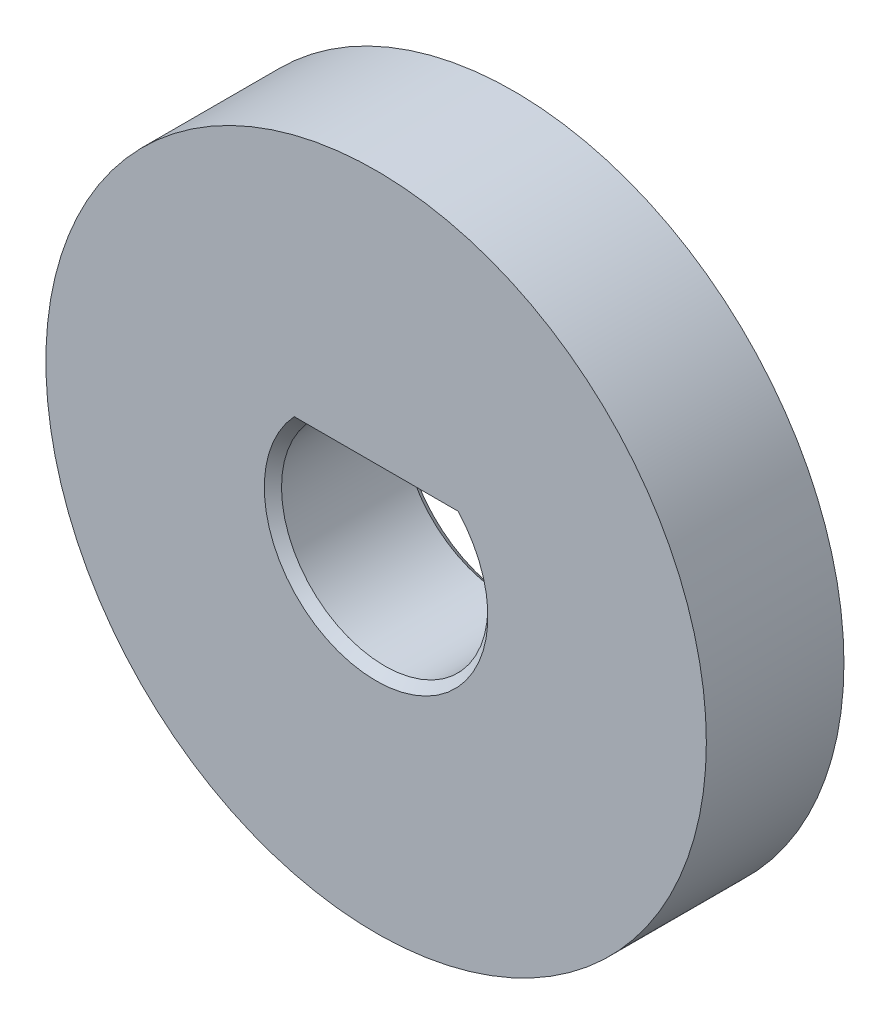
ISO-10303-21;
HEADER;
FILE_DESCRIPTION(('STEP AP214'),'2;1');
FILE_NAME('part.step','',(''),(''),'','','');
FILE_SCHEMA(('AUTOMOTIVE_DESIGN { 1 0 10303 214 1 1 1 1 }'));
ENDSEC;
DATA;
#1=APPLICATION_CONTEXT('core data for automotive mechanical design processes');
#2=APPLICATION_PROTOCOL_DEFINITION('international standard','automotive_design',2000,#1);
#3=PRODUCT_CONTEXT('',#1,'mechanical');
#4=PRODUCT('Part','Part','',(#3));
#5=PRODUCT_RELATED_PRODUCT_CATEGORY('part','',(#4));
#6=PRODUCT_DEFINITION_FORMATION('','',#4);
#7=PRODUCT_DEFINITION_CONTEXT('part definition',#1,'design');
#8=PRODUCT_DEFINITION('design','',#6,#7);
#9=PRODUCT_DEFINITION_SHAPE('','',#8);
#10=(LENGTH_UNIT() NAMED_UNIT(*) SI_UNIT(.MILLI.,.METRE.));
#11=(NAMED_UNIT(*) PLANE_ANGLE_UNIT() SI_UNIT($,.RADIAN.));
#12=(NAMED_UNIT(*) SI_UNIT($,.STERADIAN.) SOLID_ANGLE_UNIT());
#13=UNCERTAINTY_MEASURE_WITH_UNIT(LENGTH_MEASURE(1.E-05),#10,'distance_accuracy_value','');
#14=(GEOMETRIC_REPRESENTATION_CONTEXT(3) GLOBAL_UNCERTAINTY_ASSIGNED_CONTEXT((#13)) GLOBAL_UNIT_ASSIGNED_CONTEXT((#10,
#11,#12)) REPRESENTATION_CONTEXT('',''));
#15=CARTESIAN_POINT('',(0.,0.,0.));
#16=DIRECTION('',(0.,0.,1.));
#17=DIRECTION('',(1.,0.,0.));
#18=AXIS2_PLACEMENT_3D('',#15,#16,#17);
#19=CARTESIAN_POINT('',(0.,0.,6.35));
#20=DIRECTION('',(0.,0.,1.));
#21=DIRECTION('',(1.,0.,0.));
#22=AXIS2_PLACEMENT_3D('',#19,#20,#21);
#23=PLANE('',#22);
#24=CARTESIAN_POINT('',(0.,0.,6.35));
#25=DIRECTION('',(0.,0.,1.));
#26=DIRECTION('',(1.,0.,0.));
#27=AXIS2_PLACEMENT_3D('',#24,#25,#26);
#28=CIRCLE('',#27,10.31875);
#29=CARTESIAN_POINT('',(7.55817283227238,7.025,6.35));
#30=VERTEX_POINT('',#29);
#31=CARTESIAN_POINT('',(-7.55817283227237,7.025,6.35));
#32=VERTEX_POINT('',#31);
#33=EDGE_CURVE('E95',#30,#32,#28,.F.);
#34=ORIENTED_EDGE('',*,*,#33,.T.);
#35=DIRECTION('',(-1.,0.,0.));
#36=VECTOR('',#35,1.);
#37=CARTESIAN_POINT('',(0.,7.025,6.35));
#38=LINE('',#37,#36);
#39=EDGE_CURVE('E62',#30,#32,#38,.T.);
#40=ORIENTED_EDGE('',*,*,#39,.F.);
#41=EDGE_LOOP('',(#34,#40));
#42=FACE_BOUND('',#41,.T.);
#43=CARTESIAN_POINT('',(0.,0.,6.35));
#44=DIRECTION('',(0.,0.,1.));
#45=DIRECTION('',(1.,0.,0.));
#46=AXIS2_PLACEMENT_3D('',#43,#44,#45);
#47=CIRCLE('',#46,30.48);
#48=CARTESIAN_POINT('',(30.48,0.,6.35));
#49=VERTEX_POINT('',#48);
#50=EDGE_CURVE('E112',#49,#49,#47,.T.);
#51=ORIENTED_EDGE('',*,*,#50,.T.);
#52=EDGE_LOOP('',(#51));
#53=FACE_BOUND('',#52,.T.);
#54=ADVANCED_FACE('F41',(#42,#53),#23,.T.);
#55=CARTESIAN_POINT('',(0.,0.,-6.35));
#56=DIRECTION('',(0.,0.,1.));
#57=DIRECTION('',(1.,0.,0.));
#58=AXIS2_PLACEMENT_3D('',#55,#56,#57);
#59=PLANE('',#58);
#60=CARTESIAN_POINT('',(0.,0.,-6.35));
#61=DIRECTION('',(0.,0.,1.));
#62=DIRECTION('',(1.,0.,0.));
#63=AXIS2_PLACEMENT_3D('',#60,#61,#62);
#64=CIRCLE('',#63,10.31875);
#65=CARTESIAN_POINT('',(-7.55817283227237,7.025,-6.35));
#66=VERTEX_POINT('',#65);
#67=CARTESIAN_POINT('',(7.55817283227237,7.025,-6.35));
#68=VERTEX_POINT('',#67);
#69=EDGE_CURVE('E108',#66,#68,#64,.T.);
#70=ORIENTED_EDGE('',*,*,#69,.T.);
#71=DIRECTION('',(-1.,0.,0.));
#72=VECTOR('',#71,1.);
#73=CARTESIAN_POINT('',(0.,7.025,-6.35));
#74=LINE('',#73,#72);
#75=EDGE_CURVE('E91',#68,#66,#74,.T.);
#76=ORIENTED_EDGE('',*,*,#75,.T.);
#77=EDGE_LOOP('',(#70,#76));
#78=FACE_BOUND('',#77,.T.);
#79=CARTESIAN_POINT('',(0.,0.,-6.35));
#80=DIRECTION('',(0.,0.,1.));
#81=DIRECTION('',(1.,0.,0.));
#82=AXIS2_PLACEMENT_3D('',#79,#80,#81);
#83=CIRCLE('',#82,30.48);
#84=CARTESIAN_POINT('',(30.48,0.,-6.35));
#85=VERTEX_POINT('',#84);
#86=EDGE_CURVE('E113',#85,#85,#83,.T.);
#87=ORIENTED_EDGE('',*,*,#86,.F.);
#88=EDGE_LOOP('',(#87));
#89=FACE_BOUND('',#88,.T.);
#90=ADVANCED_FACE('F145',(#78,#89),#59,.F.);
#91=CARTESIAN_POINT('',(0.,0.,6.35));
#92=DIRECTION('',(0.,0.,-1.));
#93=DIRECTION('',(-1.,0.,0.));
#94=AXIS2_PLACEMENT_3D('',#91,#92,#93);
#95=CYLINDRICAL_SURFACE('',#94,30.48);
#96=ORIENTED_EDGE('',*,*,#50,.F.);
#97=EDGE_LOOP('',(#96));
#98=FACE_BOUND('',#97,.T.);
#99=ORIENTED_EDGE('',*,*,#86,.T.);
#100=EDGE_LOOP('',(#99));
#101=FACE_BOUND('',#100,.T.);
#102=ADVANCED_FACE('F141',(#98,#101),#95,.T.);
#103=CARTESIAN_POINT('',(0.,0.,6.35));
#104=DIRECTION('',(0.,0.,-1.));
#105=DIRECTION('',(-1.,0.,0.));
#106=AXIS2_PLACEMENT_3D('',#103,#104,#105);
#107=CYLINDRICAL_SURFACE('',#106,9.525);
#108=DIRECTION('',(0.,0.,-1.));
#109=VECTOR('',#108,1.);
#110=CARTESIAN_POINT('',(-6.4323401651343,7.025,6.35));
#111=LINE('',#110,#109);
#112=CARTESIAN_POINT('',(-6.4323401651343,7.025,5.55624999999999));
#113=VERTEX_POINT('',#112);
#114=CARTESIAN_POINT('',(-6.4323401651343,7.025,-5.55624999999998));
#115=VERTEX_POINT('',#114);
#116=EDGE_CURVE('E69',#113,#115,#111,.T.);
#117=ORIENTED_EDGE('',*,*,#116,.F.);
#118=CARTESIAN_POINT('',(0.,0.,5.55624999999999));
#119=DIRECTION('',(0.,0.,1.));
#120=DIRECTION('',(1.,0.,0.));
#121=AXIS2_PLACEMENT_3D('',#118,#119,#120);
#122=CIRCLE('',#121,9.525);
#123=CARTESIAN_POINT('',(6.4323401651343,7.025,5.55624999999999));
#124=VERTEX_POINT('',#123);
#125=EDGE_CURVE('E97',#113,#124,#122,.T.);
#126=ORIENTED_EDGE('',*,*,#125,.T.);
#127=DIRECTION('',(0.,0.,-1.));
#128=VECTOR('',#127,1.);
#129=CARTESIAN_POINT('',(6.4323401651343,7.025,6.35));
#130=LINE('',#129,#128);
#131=CARTESIAN_POINT('',(6.4323401651343,7.025,-5.55624999999998));
#132=VERTEX_POINT('',#131);
#133=EDGE_CURVE('E90',#132,#124,#130,.F.);
#134=ORIENTED_EDGE('',*,*,#133,.F.);
#135=CARTESIAN_POINT('',(0.,0.,-5.55624999999998));
#136=DIRECTION('',(0.,0.,1.));
#137=DIRECTION('',(1.,0.,0.));
#138=AXIS2_PLACEMENT_3D('',#135,#136,#137);
#139=CIRCLE('',#138,9.525);
#140=EDGE_CURVE('E100',#132,#115,#139,.F.);
#141=ORIENTED_EDGE('',*,*,#140,.T.);
#142=EDGE_LOOP('',(#117,#126,#134,#141));
#143=FACE_BOUND('',#142,.T.);
#144=ADVANCED_FACE('F137',(#143),#107,.F.);
#145=CARTESIAN_POINT('',(0.,0.,-6.35));
#146=DIRECTION('',(0.,0.,-1.));
#147=DIRECTION('',(-1.,0.,0.));
#148=AXIS2_PLACEMENT_3D('',#145,#146,#147);
#149=CONICAL_SURFACE('',#148,10.31875,0.785398163397442);
#150=CARTESIAN_POINT('',(7.55887283227237,7.025,-6.3505127398698));
#151=CARTESIAN_POINT('',(7.35918376734584,7.025,-6.20428210737378));
#152=CARTESIAN_POINT('',(7.15823650909129,7.025,-6.05973510950676));
#153=CARTESIAN_POINT('',(6.75330813641482,7.025,-5.77480510392177));
#154=CARTESIAN_POINT('',(6.54932596627356,7.025,-5.63442359857721));
#155=CARTESIAN_POINT('',(6.13572671734289,7.025,-5.35723538660261));
#156=CARTESIAN_POINT('',(5.92607255101003,7.025,-5.22048378604721));
#157=CARTESIAN_POINT('',(5.50275471913161,7.025,-4.953355003917));
#158=CARTESIAN_POINT('',(5.28909143621303,7.025,-4.82297721826931));
#159=CARTESIAN_POINT('',(4.84720322304359,7.025,-4.56427107586427));
#160=CARTESIAN_POINT('',(4.61876043588918,7.025,-4.43631250634792));
#161=CARTESIAN_POINT('',(4.15604697189046,7.025,-4.19120319052273));
#162=CARTESIAN_POINT('',(3.92177517493467,7.025,-4.07405454215036));
#163=CARTESIAN_POINT('',(3.44783902345875,7.025,-3.85393355395983));
#164=CARTESIAN_POINT('',(3.2082025462592,7.025,-3.75090178751881));
#165=CARTESIAN_POINT('',(2.7222966344759,7.025,-3.56195297840614));
#166=CARTESIAN_POINT('',(2.47603006971897,7.025,-3.47602866181998));
#167=CARTESIAN_POINT('',(1.99237061337792,7.025,-3.32990663640796));
#168=CARTESIAN_POINT('',(1.75536251931876,7.025,-3.26845237530357));
#169=CARTESIAN_POINT('',(1.27660854390952,7.025,-3.16747270361179));
#170=CARTESIAN_POINT('',(1.03486225677417,7.025,-3.12794917977334));
#171=CARTESIAN_POINT('',(0.55269320041436,7.025,-3.07395724161466));
#172=CARTESIAN_POINT('',(0.312317663752035,7.025,-3.05907476799947));
#173=CARTESIAN_POINT('',(-0.168684811790302,7.025,-3.05415939058828));
#174=CARTESIAN_POINT('',(-0.409311740248241,7.025,-3.06412549454261));
#175=CARTESIAN_POINT('',(-0.887554271636103,7.025,-3.10810027201536));
#176=CARTESIAN_POINT('',(-1.12517692268702,7.025,-3.14203391318885));
#177=CARTESIAN_POINT('',(-1.59626144111939,7.025,-3.23160603938917));
#178=CARTESIAN_POINT('',(-1.82972256784796,7.025,-3.2872483484994));
#179=CARTESIAN_POINT('',(-2.29513103306947,7.025,-3.41823297936479));
#180=CARTESIAN_POINT('',(-2.52698980625695,7.025,-3.49388525698236));
#181=CARTESIAN_POINT('',(-2.98482535058204,7.025,-3.6610832726471));
#182=CARTESIAN_POINT('',(-3.21080225130833,7.025,-3.75262866019782));
#183=CARTESIAN_POINT('',(-3.62223490032214,7.025,-3.93331260256053));
#184=CARTESIAN_POINT('',(-3.80851369015214,7.025,-4.02059974805053));
#185=CARTESIAN_POINT('',(-4.17730547652864,7.025,-4.20283487097954));
#186=CARTESIAN_POINT('',(-4.35981788631633,7.025,-4.29778403092632));
#187=CARTESIAN_POINT('',(-4.72157623630672,7.025,-4.49415765684352));
#188=CARTESIAN_POINT('',(-4.9008182296593,7.025,-4.59558935726586));
#189=CARTESIAN_POINT('',(-5.25618202441421,7.025,-4.80378331806421));
#190=CARTESIAN_POINT('',(-5.43230364666881,7.025,-4.91054588316254));
#191=CARTESIAN_POINT('',(-5.77438365628094,7.025,-5.12394084059766));
#192=CARTESIAN_POINT('',(-5.94045743064147,7.025,-5.23038886935131));
#193=CARTESIAN_POINT('',(-6.27032150157057,7.025,-5.44677261375206));
#194=CARTESIAN_POINT('',(-6.43411171217845,7.025,-5.55670846018435));
#195=CARTESIAN_POINT('',(-6.75910887197629,7.025,-5.77918172824511));
#196=CARTESIAN_POINT('',(-6.92032261604102,7.025,-5.89170924773562));
#197=CARTESIAN_POINT('',(-7.24091463316011,7.025,-6.11930298739434));
#198=CARTESIAN_POINT('',(-7.40029316678262,7.025,-6.23436884022645));
#199=CARTESIAN_POINT('',(-7.55887283227237,7.025,-6.3505127398698));
#200=B_SPLINE_CURVE_WITH_KNOTS('',3,(#150,#151,#152,#153,#154,#155,#156,#157,#158,#159,#160,
#161,#162,#163,#164,#165,#166,#167,#168,#169,#170,#171,#172,#173,#174,#175,#176,#177,#178,#179,
#180,#181,#182,#183,#184,#185,#186,#187,#188,#189,#190,#191,#192,#193,#194,#195,#196,#197,#198,
#199),.UNSPECIFIED.,.F.,.F.,(4,2,2,2,2,2,2,2,2,2,2,2,2,2,2,2,2,2,2,2,2,2,2,2,4),(0.,
0.742538822186623,1.48534227943686,2.2361819661253,2.98695035411688,3.77223452403001,
4.55767077890547,5.33969179334179,6.12137958691087,6.85502693102897,7.58873738263889,
8.30998884371148,9.03121150434058,9.75018626868392,10.46928774102,11.2002565723871,
11.9312092854837,12.5481605799352,13.1652072735981,13.7829550344109,14.4007381473705,
14.992469614563,15.5842232966196,16.1740029205942,16.7636977470925),.UNSPECIFIED.);
#201=EDGE_CURVE('E123',#68,#132,#200,.T.);
#202=ORIENTED_EDGE('',*,*,#201,.F.);
#203=ORIENTED_EDGE('',*,*,#69,.F.);
#204=EDGE_CURVE('E117',#115,#66,#200,.T.);
#205=ORIENTED_EDGE('',*,*,#204,.F.);
#206=ORIENTED_EDGE('',*,*,#140,.F.);
#207=EDGE_LOOP('',(#202,#203,#205,#206));
#208=FACE_BOUND('',#207,.T.);
#209=ADVANCED_FACE('F131',(#208),#149,.F.);
#210=CARTESIAN_POINT('',(0.,0.,5.55624999999999));
#211=DIRECTION('',(0.,0.,1.));
#212=DIRECTION('',(1.,0.,0.));
#213=AXIS2_PLACEMENT_3D('',#210,#211,#212);
#214=CONICAL_SURFACE('',#213,9.525,0.78539816339745);
#215=CARTESIAN_POINT('',(-7.55887283227237,7.025,6.35051273986979));
#216=CARTESIAN_POINT('',(-7.35918376734584,7.025,6.20428210737377));
#217=CARTESIAN_POINT('',(-7.15823650909128,7.025,6.05973510950675));
#218=CARTESIAN_POINT('',(-6.75330813641482,7.025,5.77480510392177));
#219=CARTESIAN_POINT('',(-6.54932596627355,7.025,5.63442359857722));
#220=CARTESIAN_POINT('',(-6.13572671734288,7.025,5.35723538660262));
#221=CARTESIAN_POINT('',(-5.92607255101002,7.025,5.22048378604722));
#222=CARTESIAN_POINT('',(-5.5027547191316,7.025,4.95335500391701));
#223=CARTESIAN_POINT('',(-5.28909143621302,7.025,4.82297721826932));
#224=CARTESIAN_POINT('',(-4.84720322304358,7.025,4.56427107586429));
#225=CARTESIAN_POINT('',(-4.61876043588917,7.025,4.43631250634794));
#226=CARTESIAN_POINT('',(-4.15604697189045,7.025,4.19120319052276));
#227=CARTESIAN_POINT('',(-3.92177517493466,7.025,4.07405454215038));
#228=CARTESIAN_POINT('',(-3.44783902345874,7.025,3.85393355395986));
#229=CARTESIAN_POINT('',(-3.20820254625919,7.025,3.75090178751885));
#230=CARTESIAN_POINT('',(-2.7222966344759,7.025,3.56195297840618));
#231=CARTESIAN_POINT('',(-2.47603006971896,7.025,3.47602866182002));
#232=CARTESIAN_POINT('',(-1.99237061337791,7.025,3.329906636408));
#233=CARTESIAN_POINT('',(-1.75536251931875,7.025,3.26845237530362));
#234=CARTESIAN_POINT('',(-1.2766085439095,7.025,3.16747270361183));
#235=CARTESIAN_POINT('',(-1.03486225677414,7.025,3.12794917977338));
#236=CARTESIAN_POINT('',(-0.552693200414325,7.025,3.07395724161471));
#237=CARTESIAN_POINT('',(-0.312317663751996,7.025,3.05907476799952));
#238=CARTESIAN_POINT('',(0.16868481179035,7.025,3.05415939058833));
#239=CARTESIAN_POINT('',(0.409311740248292,7.025,3.06412549454267));
#240=CARTESIAN_POINT('',(0.887554271636161,7.025,3.10810027201542));
#241=CARTESIAN_POINT('',(1.12517692268709,7.025,3.14203391318891));
#242=CARTESIAN_POINT('',(1.59626144111946,7.025,3.23160603938924));
#243=CARTESIAN_POINT('',(1.82972256784803,7.025,3.28724834849946));
#244=CARTESIAN_POINT('',(2.29513103306955,7.025,3.41823297936486));
#245=CARTESIAN_POINT('',(2.52698980625703,7.025,3.49388525698243));
#246=CARTESIAN_POINT('',(2.98482535058213,7.025,3.66108327264718));
#247=CARTESIAN_POINT('',(3.21080225130843,7.025,3.75262866019789));
#248=CARTESIAN_POINT('',(3.62223490032223,7.025,3.93331260256061));
#249=CARTESIAN_POINT('',(3.80851369015222,7.025,4.02059974805061));
#250=CARTESIAN_POINT('',(4.17730547652872,7.025,4.20283487097961));
#251=CARTESIAN_POINT('',(4.3598178863164,7.025,4.29778403092639));
#252=CARTESIAN_POINT('',(4.72157623630678,7.025,4.49415765684357));
#253=CARTESIAN_POINT('',(4.90081822965935,7.025,4.59558935726591));
#254=CARTESIAN_POINT('',(5.25618202441425,7.025,4.80378331806426));
#255=CARTESIAN_POINT('',(5.43230364666885,7.025,4.91054588316259));
#256=CARTESIAN_POINT('',(5.77438365628097,7.025,5.1239408405977));
#257=CARTESIAN_POINT('',(5.94045743064149,7.025,5.23038886935134));
#258=CARTESIAN_POINT('',(6.27032150157059,7.025,5.44677261375208));
#259=CARTESIAN_POINT('',(6.43411171217847,7.025,5.55670846018437));
#260=CARTESIAN_POINT('',(6.7591088719763,7.025,5.77918172824513));
#261=CARTESIAN_POINT('',(6.92032261604103,7.025,5.89170924773563));
#262=CARTESIAN_POINT('',(7.24091463316012,7.025,6.11930298739434));
#263=CARTESIAN_POINT('',(7.40029316678262,7.025,6.23436884022645));
#264=CARTESIAN_POINT('',(7.55887283227237,7.025,6.35051273986979));
#265=B_SPLINE_CURVE_WITH_KNOTS('',3,(#215,#216,#217,#218,#219,#220,#221,#222,#223,#224,#225,
#226,#227,#228,#229,#230,#231,#232,#233,#234,#235,#236,#237,#238,#239,#240,#241,#242,#243,#244,
#245,#246,#247,#248,#249,#250,#251,#252,#253,#254,#255,#256,#257,#258,#259,#260,#261,#262,#263,
#264),.UNSPECIFIED.,.F.,.F.,(4,2,2,2,2,2,2,2,2,2,2,2,2,2,2,2,2,2,2,2,2,2,2,2,4),(0.,
0.742538822186624,1.48534227943686,2.23618196612529,2.98695035411688,3.77223452403001,
4.55767077890546,5.33969179334177,6.12137958691085,6.85502693102896,7.5887373826389,
8.30998884371149,9.03121150434061,9.75018626868396,10.4692877410201,11.2002565723872,
11.9312092854837,12.5481605799352,13.1652072735981,13.7829550344109,14.4007381473705,
14.992469614563,15.5842232966196,16.1740029205941,16.7636977470924),.UNSPECIFIED.);
#266=EDGE_CURVE('E11',#32,#113,#265,.T.);
#267=ORIENTED_EDGE('',*,*,#266,.F.);
#268=ORIENTED_EDGE('',*,*,#33,.F.);
#269=EDGE_CURVE('E46',#124,#30,#265,.T.);
#270=ORIENTED_EDGE('',*,*,#269,.F.);
#271=ORIENTED_EDGE('',*,*,#125,.F.);
#272=EDGE_LOOP('',(#267,#268,#270,#271));
#273=FACE_BOUND('',#272,.T.);
#274=ADVANCED_FACE('F43',(#273),#214,.F.);
#275=CARTESIAN_POINT('',(0.,7.025,6.35));
#276=DIRECTION('',(0.,-1.,0.));
#277=DIRECTION('',(0.,0.,-1.));
#278=AXIS2_PLACEMENT_3D('',#275,#276,#277);
#279=PLANE('',#278);
#280=ORIENTED_EDGE('',*,*,#116,.T.);
#281=ORIENTED_EDGE('',*,*,#204,.T.);
#282=ORIENTED_EDGE('',*,*,#75,.F.);
#283=ORIENTED_EDGE('',*,*,#201,.T.);
#284=ORIENTED_EDGE('',*,*,#133,.T.);
#285=ORIENTED_EDGE('',*,*,#269,.T.);
#286=ORIENTED_EDGE('',*,*,#39,.T.);
#287=ORIENTED_EDGE('',*,*,#266,.T.);
#288=EDGE_LOOP('',(#280,#281,#282,#283,#284,#285,#286,#287));
#289=FACE_BOUND('',#288,.T.);
#290=ADVANCED_FACE('F86',(#289),#279,.T.);
#291=CLOSED_SHELL('',(#54,#90,#102,#144,#209,#274,#290));
#292=MANIFOLD_SOLID_BREP('B2',#291);
#293=ADVANCED_BREP_SHAPE_REPRESENTATION('',(#18,#292),#14);
#294=SHAPE_DEFINITION_REPRESENTATION(#9,#293);
ENDSEC;
END-ISO-10303-21;
